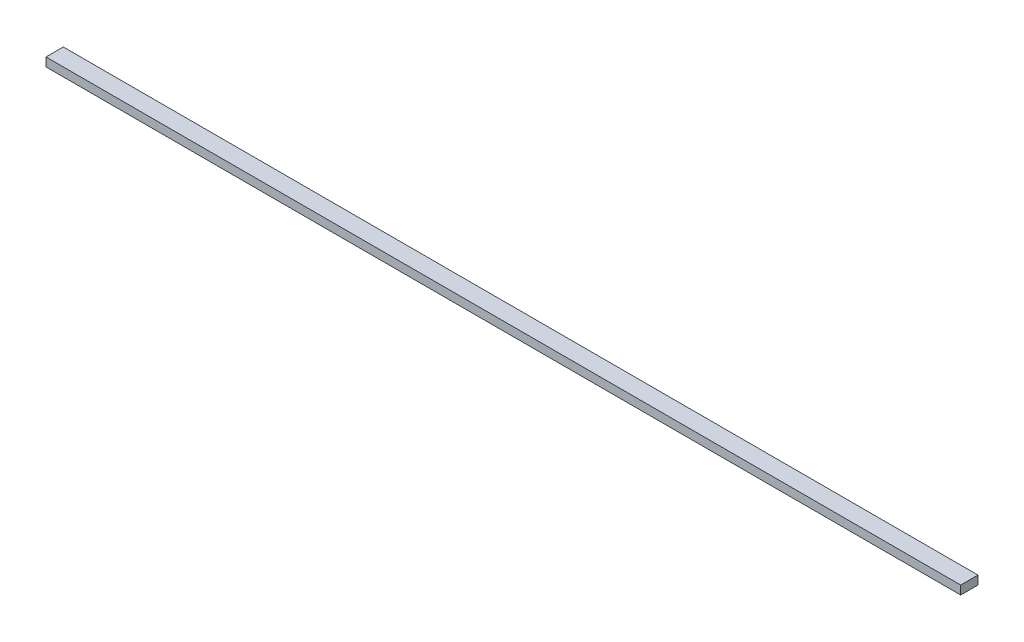
ISO-10303-21;
HEADER;
FILE_DESCRIPTION(('STEP AP214'),'2;1');
FILE_NAME('part.step','',(''),(''),'','','');
FILE_SCHEMA(('AUTOMOTIVE_DESIGN { 1 0 10303 214 1 1 1 1 }'));
ENDSEC;
DATA;
#1=APPLICATION_CONTEXT('core data for automotive mechanical design processes');
#2=APPLICATION_PROTOCOL_DEFINITION('international standard','automotive_design',2000,#1);
#3=PRODUCT_CONTEXT('',#1,'mechanical');
#4=PRODUCT('Part','Part','',(#3));
#5=PRODUCT_RELATED_PRODUCT_CATEGORY('part','',(#4));
#6=PRODUCT_DEFINITION_FORMATION('','',#4);
#7=PRODUCT_DEFINITION_CONTEXT('part definition',#1,'design');
#8=PRODUCT_DEFINITION('design','',#6,#7);
#9=PRODUCT_DEFINITION_SHAPE('','',#8);
#10=(LENGTH_UNIT() NAMED_UNIT(*) SI_UNIT(.MILLI.,.METRE.));
#11=(NAMED_UNIT(*) PLANE_ANGLE_UNIT() SI_UNIT($,.RADIAN.));
#12=(NAMED_UNIT(*) SI_UNIT($,.STERADIAN.) SOLID_ANGLE_UNIT());
#13=UNCERTAINTY_MEASURE_WITH_UNIT(LENGTH_MEASURE(1.E-05),#10,'distance_accuracy_value','');
#14=(GEOMETRIC_REPRESENTATION_CONTEXT(3) GLOBAL_UNCERTAINTY_ASSIGNED_CONTEXT((#13)) GLOBAL_UNIT_ASSIGNED_CONTEXT((#10,
#11,#12)) REPRESENTATION_CONTEXT('',''));
#15=CARTESIAN_POINT('',(0.,0.,0.));
#16=DIRECTION('',(0.,0.,1.));
#17=DIRECTION('',(1.,0.,0.));
#18=AXIS2_PLACEMENT_3D('',#15,#16,#17);
#19=CARTESIAN_POINT('',(-335.756250000003,3.17499999999995,12.7));
#20=DIRECTION('',(1.,0.,0.));
#21=DIRECTION('',(0.,0.,-1.));
#22=AXIS2_PLACEMENT_3D('',#19,#20,#21);
#23=PLANE('',#22);
#24=DIRECTION('',(0.,-1.,0.));
#25=VECTOR('',#24,1.);
#26=CARTESIAN_POINT('',(-335.756250000003,3.17499999999995,0.));
#27=LINE('',#26,#25);
#28=CARTESIAN_POINT('',(-335.756250000003,3.17499999999995,0.));
#29=VERTEX_POINT('',#28);
#30=CARTESIAN_POINT('',(-335.756250000003,-3.17500000000005,0.));
#31=VERTEX_POINT('',#30);
#32=EDGE_CURVE('E95',#29,#31,#27,.T.);
#33=ORIENTED_EDGE('',*,*,#32,.T.);
#34=DIRECTION('',(0.,0.,-1.));
#35=VECTOR('',#34,1.);
#36=CARTESIAN_POINT('',(-335.756250000003,-3.17500000000005,12.7));
#37=LINE('',#36,#35);
#38=CARTESIAN_POINT('',(-335.756250000003,-3.17500000000005,12.7));
#39=VERTEX_POINT('',#38);
#40=EDGE_CURVE('E11',#39,#31,#37,.T.);
#41=ORIENTED_EDGE('',*,*,#40,.F.);
#42=DIRECTION('',(0.,-1.,0.));
#43=VECTOR('',#42,1.);
#44=CARTESIAN_POINT('',(-335.756250000003,3.17499999999995,12.7));
#45=LINE('',#44,#43);
#46=CARTESIAN_POINT('',(-335.756250000003,3.17499999999995,12.7));
#47=VERTEX_POINT('',#46);
#48=EDGE_CURVE('E83',#47,#39,#45,.T.);
#49=ORIENTED_EDGE('',*,*,#48,.F.);
#50=DIRECTION('',(0.,0.,-1.));
#51=VECTOR('',#50,1.);
#52=CARTESIAN_POINT('',(-335.756250000003,3.17499999999995,12.7));
#53=LINE('',#52,#51);
#54=EDGE_CURVE('E91',#47,#29,#53,.T.);
#55=ORIENTED_EDGE('',*,*,#54,.T.);
#56=EDGE_LOOP('',(#33,#41,#49,#55));
#57=FACE_BOUND('',#56,.T.);
#58=ADVANCED_FACE('F32',(#57),#23,.F.);
#59=CARTESIAN_POINT('',(335.756249999997,-3.17499999999996,12.7));
#60=DIRECTION('',(0.,1.,0.));
#61=DIRECTION('',(-1.,0.,0.));
#62=AXIS2_PLACEMENT_3D('',#59,#60,#61);
#63=PLANE('',#62);
#64=DIRECTION('',(1.,0.,0.));
#65=VECTOR('',#64,1.);
#66=CARTESIAN_POINT('',(335.756249999997,-3.17499999999996,0.));
#67=LINE('',#66,#65);
#68=CARTESIAN_POINT('',(335.756249999997,-3.17499999999996,0.));
#69=VERTEX_POINT('',#68);
#70=EDGE_CURVE('E87',#31,#69,#67,.T.);
#71=ORIENTED_EDGE('',*,*,#70,.T.);
#72=DIRECTION('',(0.,0.,-1.));
#73=VECTOR('',#72,1.);
#74=CARTESIAN_POINT('',(335.756249999997,-3.17499999999996,12.7));
#75=LINE('',#74,#73);
#76=CARTESIAN_POINT('',(335.756249999997,-3.17499999999996,12.7));
#77=VERTEX_POINT('',#76);
#78=EDGE_CURVE('E40',#77,#69,#75,.T.);
#79=ORIENTED_EDGE('',*,*,#78,.F.);
#80=DIRECTION('',(1.,0.,0.));
#81=VECTOR('',#80,1.);
#82=CARTESIAN_POINT('',(335.756249999997,-3.17499999999996,12.7));
#83=LINE('',#82,#81);
#84=EDGE_CURVE('E78',#39,#77,#83,.T.);
#85=ORIENTED_EDGE('',*,*,#84,.F.);
#86=ORIENTED_EDGE('',*,*,#40,.T.);
#87=EDGE_LOOP('',(#71,#79,#85,#86));
#88=FACE_BOUND('',#87,.T.);
#89=ADVANCED_FACE('F86',(#88),#63,.F.);
#90=CARTESIAN_POINT('',(335.756249999997,3.17500000000003,12.7));
#91=DIRECTION('',(-1.,0.,0.));
#92=DIRECTION('',(0.,0.,1.));
#93=AXIS2_PLACEMENT_3D('',#90,#91,#92);
#94=PLANE('',#93);
#95=DIRECTION('',(0.,1.,0.));
#96=VECTOR('',#95,1.);
#97=CARTESIAN_POINT('',(335.756249999997,3.17500000000003,0.));
#98=LINE('',#97,#96);
#99=CARTESIAN_POINT('',(335.756249999997,3.17500000000003,0.));
#100=VERTEX_POINT('',#99);
#101=EDGE_CURVE('E65',#69,#100,#98,.T.);
#102=ORIENTED_EDGE('',*,*,#101,.T.);
#103=DIRECTION('',(0.,0.,-1.));
#104=VECTOR('',#103,1.);
#105=CARTESIAN_POINT('',(335.756249999997,3.17500000000003,12.7));
#106=LINE('',#105,#104);
#107=CARTESIAN_POINT('',(335.756249999997,3.17500000000003,12.7));
#108=VERTEX_POINT('',#107);
#109=EDGE_CURVE('E88',#108,#100,#106,.T.);
#110=ORIENTED_EDGE('',*,*,#109,.F.);
#111=DIRECTION('',(0.,1.,0.));
#112=VECTOR('',#111,1.);
#113=CARTESIAN_POINT('',(335.756249999997,3.17500000000003,12.7));
#114=LINE('',#113,#112);
#115=EDGE_CURVE('E81',#77,#108,#114,.T.);
#116=ORIENTED_EDGE('',*,*,#115,.F.);
#117=ORIENTED_EDGE('',*,*,#78,.T.);
#118=EDGE_LOOP('',(#102,#110,#116,#117));
#119=FACE_BOUND('',#118,.T.);
#120=ADVANCED_FACE('F89',(#119),#94,.F.);
#121=CARTESIAN_POINT('',(335.756249999997,3.17500000000003,12.7));
#122=DIRECTION('',(0.,-1.,0.));
#123=DIRECTION('',(1.,0.,0.));
#124=AXIS2_PLACEMENT_3D('',#121,#122,#123);
#125=PLANE('',#124);
#126=DIRECTION('',(-1.,0.,0.));
#127=VECTOR('',#126,1.);
#128=CARTESIAN_POINT('',(335.756249999997,3.17500000000003,0.));
#129=LINE('',#128,#127);
#130=EDGE_CURVE('E71',#100,#29,#129,.T.);
#131=ORIENTED_EDGE('',*,*,#130,.T.);
#132=ORIENTED_EDGE('',*,*,#54,.F.);
#133=DIRECTION('',(-1.,0.,0.));
#134=VECTOR('',#133,1.);
#135=CARTESIAN_POINT('',(335.756249999997,3.17500000000003,12.7));
#136=LINE('',#135,#134);
#137=EDGE_CURVE('E48',#108,#47,#136,.T.);
#138=ORIENTED_EDGE('',*,*,#137,.F.);
#139=ORIENTED_EDGE('',*,*,#109,.T.);
#140=EDGE_LOOP('',(#131,#132,#138,#139));
#141=FACE_BOUND('',#140,.T.);
#142=ADVANCED_FACE('F102',(#141),#125,.F.);
#143=CARTESIAN_POINT('',(0.,0.,12.7));
#144=DIRECTION('',(0.,0.,-1.));
#145=DIRECTION('',(-1.,0.,0.));
#146=AXIS2_PLACEMENT_3D('',#143,#144,#145);
#147=PLANE('',#146);
#148=ORIENTED_EDGE('',*,*,#48,.T.);
#149=ORIENTED_EDGE('',*,*,#84,.T.);
#150=ORIENTED_EDGE('',*,*,#115,.T.);
#151=ORIENTED_EDGE('',*,*,#137,.T.);
#152=EDGE_LOOP('',(#148,#149,#150,#151));
#153=FACE_BOUND('',#152,.T.);
#154=ADVANCED_FACE('F79',(#153),#147,.F.);
#155=CARTESIAN_POINT('',(0.,0.,0.));
#156=DIRECTION('',(0.,0.,-1.));
#157=DIRECTION('',(-1.,0.,0.));
#158=AXIS2_PLACEMENT_3D('',#155,#156,#157);
#159=PLANE('',#158);
#160=ORIENTED_EDGE('',*,*,#32,.F.);
#161=ORIENTED_EDGE('',*,*,#130,.F.);
#162=ORIENTED_EDGE('',*,*,#101,.F.);
#163=ORIENTED_EDGE('',*,*,#70,.F.);
#164=EDGE_LOOP('',(#160,#161,#162,#163));
#165=FACE_BOUND('',#164,.T.);
#166=ADVANCED_FACE('F105',(#165),#159,.T.);
#167=CLOSED_SHELL('',(#58,#89,#120,#142,#154,#166));
#168=MANIFOLD_SOLID_BREP('B2',#167);
#169=ADVANCED_BREP_SHAPE_REPRESENTATION('',(#18,#168),#14);
#170=SHAPE_DEFINITION_REPRESENTATION(#9,#169);
ENDSEC;
END-ISO-10303-21;
